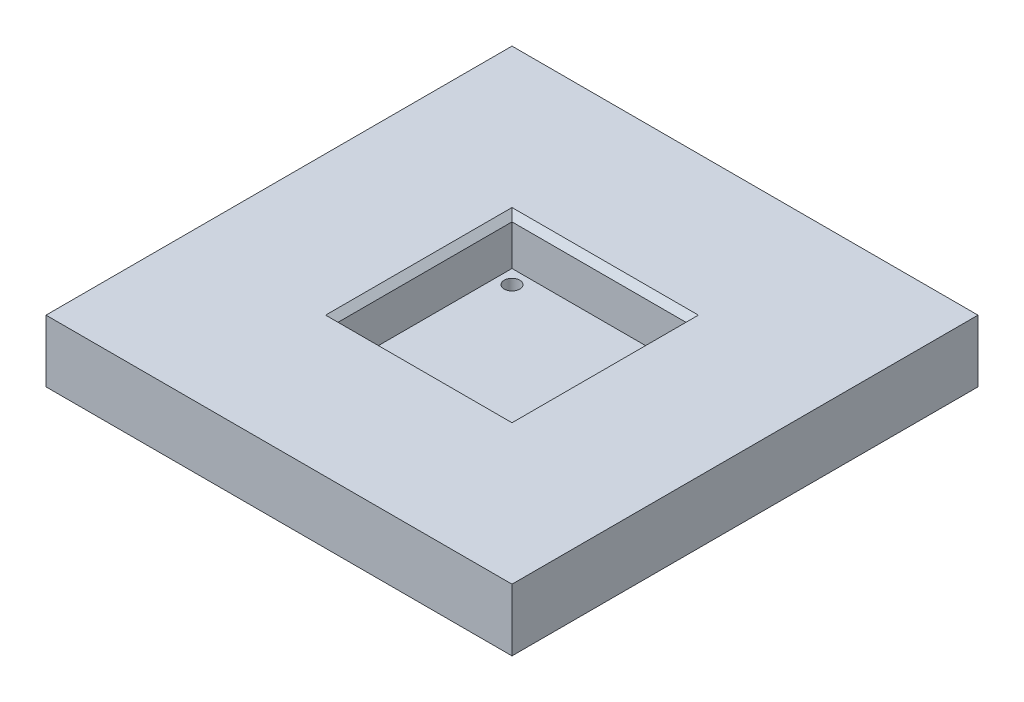
ISO-10303-21;
HEADER;
FILE_DESCRIPTION(('STEP AP214'),'2;1');
FILE_NAME('part.step','',(''),(''),'','','');
FILE_SCHEMA(('AUTOMOTIVE_DESIGN { 1 0 10303 214 1 1 1 1 }'));
ENDSEC;
DATA;
#1=APPLICATION_CONTEXT('core data for automotive mechanical design processes');
#2=APPLICATION_PROTOCOL_DEFINITION('international standard','automotive_design',2000,#1);
#3=PRODUCT_CONTEXT('',#1,'mechanical');
#4=PRODUCT('Part','Part','',(#3));
#5=PRODUCT_RELATED_PRODUCT_CATEGORY('part','',(#4));
#6=PRODUCT_DEFINITION_FORMATION('','',#4);
#7=PRODUCT_DEFINITION_CONTEXT('part definition',#1,'design');
#8=PRODUCT_DEFINITION('design','',#6,#7);
#9=PRODUCT_DEFINITION_SHAPE('','',#8);
#10=(LENGTH_UNIT() NAMED_UNIT(*) SI_UNIT(.MILLI.,.METRE.));
#11=(NAMED_UNIT(*) PLANE_ANGLE_UNIT() SI_UNIT($,.RADIAN.));
#12=(NAMED_UNIT(*) SI_UNIT($,.STERADIAN.) SOLID_ANGLE_UNIT());
#13=UNCERTAINTY_MEASURE_WITH_UNIT(LENGTH_MEASURE(1.E-05),#10,'distance_accuracy_value','');
#14=(GEOMETRIC_REPRESENTATION_CONTEXT(3) GLOBAL_UNCERTAINTY_ASSIGNED_CONTEXT((#13)) GLOBAL_UNIT_ASSIGNED_CONTEXT((#10,
#11,#12)) REPRESENTATION_CONTEXT('',''));
#15=CARTESIAN_POINT('',(0.,0.,0.));
#16=DIRECTION('',(0.,0.,1.));
#17=DIRECTION('',(1.,0.,0.));
#18=AXIS2_PLACEMENT_3D('',#15,#16,#17);
#19=CARTESIAN_POINT('',(75.,20.,75.));
#20=DIRECTION('',(-1.,0.,0.));
#21=DIRECTION('',(0.,0.,1.));
#22=AXIS2_PLACEMENT_3D('',#19,#20,#21);
#23=PLANE('',#22);
#24=DIRECTION('',(0.,0.,-1.));
#25=VECTOR('',#24,1.);
#26=CARTESIAN_POINT('',(75.,0.,75.));
#27=LINE('',#26,#25);
#28=CARTESIAN_POINT('',(75.,0.,75.));
#29=VERTEX_POINT('',#28);
#30=CARTESIAN_POINT('',(75.,0.,-75.));
#31=VERTEX_POINT('',#30);
#32=EDGE_CURVE('E141',#29,#31,#27,.T.);
#33=ORIENTED_EDGE('',*,*,#32,.T.);
#34=DIRECTION('',(0.,-1.,0.));
#35=VECTOR('',#34,1.);
#36=CARTESIAN_POINT('',(75.,20.,-75.));
#37=LINE('',#36,#35);
#38=CARTESIAN_POINT('',(75.,20.,-75.));
#39=VERTEX_POINT('',#38);
#40=EDGE_CURVE('E171',#39,#31,#37,.T.);
#41=ORIENTED_EDGE('',*,*,#40,.F.);
#42=DIRECTION('',(0.,0.,-1.));
#43=VECTOR('',#42,1.);
#44=CARTESIAN_POINT('',(75.,20.,75.));
#45=LINE('',#44,#43);
#46=CARTESIAN_POINT('',(75.,20.,75.));
#47=VERTEX_POINT('',#46);
#48=EDGE_CURVE('E145',#47,#39,#45,.T.);
#49=ORIENTED_EDGE('',*,*,#48,.F.);
#50=DIRECTION('',(0.,-1.,0.));
#51=VECTOR('',#50,1.);
#52=CARTESIAN_POINT('',(75.,20.,75.));
#53=LINE('',#52,#51);
#54=EDGE_CURVE('E155',#47,#29,#53,.T.);
#55=ORIENTED_EDGE('',*,*,#54,.T.);
#56=EDGE_LOOP('',(#33,#41,#49,#55));
#57=FACE_BOUND('',#56,.T.);
#58=ADVANCED_FACE('F32',(#57),#23,.F.);
#59=CARTESIAN_POINT('',(-75.,20.,-75.));
#60=DIRECTION('',(0.,0.,1.));
#61=DIRECTION('',(1.,0.,0.));
#62=AXIS2_PLACEMENT_3D('',#59,#60,#61);
#63=PLANE('',#62);
#64=DIRECTION('',(-1.,0.,0.));
#65=VECTOR('',#64,1.);
#66=CARTESIAN_POINT('',(-75.,0.,-75.));
#67=LINE('',#66,#65);
#68=CARTESIAN_POINT('',(-75.,0.,-75.));
#69=VERTEX_POINT('',#68);
#70=EDGE_CURVE('E158',#31,#69,#67,.T.);
#71=ORIENTED_EDGE('',*,*,#70,.T.);
#72=DIRECTION('',(0.,-1.,0.));
#73=VECTOR('',#72,1.);
#74=CARTESIAN_POINT('',(-75.,20.,-75.));
#75=LINE('',#74,#73);
#76=CARTESIAN_POINT('',(-75.,20.,-75.));
#77=VERTEX_POINT('',#76);
#78=EDGE_CURVE('E168',#77,#69,#75,.T.);
#79=ORIENTED_EDGE('',*,*,#78,.F.);
#80=DIRECTION('',(-1.,0.,0.));
#81=VECTOR('',#80,1.);
#82=CARTESIAN_POINT('',(-75.,20.,-75.));
#83=LINE('',#82,#81);
#84=EDGE_CURVE('E148',#39,#77,#83,.T.);
#85=ORIENTED_EDGE('',*,*,#84,.F.);
#86=ORIENTED_EDGE('',*,*,#40,.T.);
#87=EDGE_LOOP('',(#71,#79,#85,#86));
#88=FACE_BOUND('',#87,.T.);
#89=ADVANCED_FACE('F239',(#88),#63,.F.);
#90=CARTESIAN_POINT('',(-75.,20.,75.));
#91=DIRECTION('',(1.,0.,0.));
#92=DIRECTION('',(0.,0.,-1.));
#93=AXIS2_PLACEMENT_3D('',#90,#91,#92);
#94=PLANE('',#93);
#95=DIRECTION('',(0.,0.,1.));
#96=VECTOR('',#95,1.);
#97=CARTESIAN_POINT('',(-75.,0.,75.));
#98=LINE('',#97,#96);
#99=CARTESIAN_POINT('',(-75.,0.,75.));
#100=VERTEX_POINT('',#99);
#101=EDGE_CURVE('E160',#69,#100,#98,.T.);
#102=ORIENTED_EDGE('',*,*,#101,.T.);
#103=DIRECTION('',(0.,-1.,0.));
#104=VECTOR('',#103,1.);
#105=CARTESIAN_POINT('',(-75.,20.,75.));
#106=LINE('',#105,#104);
#107=CARTESIAN_POINT('',(-75.,20.,75.));
#108=VERTEX_POINT('',#107);
#109=EDGE_CURVE('E165',#108,#100,#106,.T.);
#110=ORIENTED_EDGE('',*,*,#109,.F.);
#111=DIRECTION('',(0.,0.,1.));
#112=VECTOR('',#111,1.);
#113=CARTESIAN_POINT('',(-75.,20.,75.));
#114=LINE('',#113,#112);
#115=EDGE_CURVE('E151',#77,#108,#114,.T.);
#116=ORIENTED_EDGE('',*,*,#115,.F.);
#117=ORIENTED_EDGE('',*,*,#78,.T.);
#118=EDGE_LOOP('',(#102,#110,#116,#117));
#119=FACE_BOUND('',#118,.T.);
#120=ADVANCED_FACE('F245',(#119),#94,.F.);
#121=CARTESIAN_POINT('',(-75.,20.,75.));
#122=DIRECTION('',(0.,0.,-1.));
#123=DIRECTION('',(-1.,0.,0.));
#124=AXIS2_PLACEMENT_3D('',#121,#122,#123);
#125=PLANE('',#124);
#126=DIRECTION('',(1.,0.,0.));
#127=VECTOR('',#126,1.);
#128=CARTESIAN_POINT('',(-75.,0.,75.));
#129=LINE('',#128,#127);
#130=EDGE_CURVE('E149',#100,#29,#129,.T.);
#131=ORIENTED_EDGE('',*,*,#130,.T.);
#132=ORIENTED_EDGE('',*,*,#54,.F.);
#133=DIRECTION('',(1.,0.,0.));
#134=VECTOR('',#133,1.);
#135=CARTESIAN_POINT('',(-75.,20.,75.));
#136=LINE('',#135,#134);
#137=EDGE_CURVE('E153',#108,#47,#136,.T.);
#138=ORIENTED_EDGE('',*,*,#137,.F.);
#139=ORIENTED_EDGE('',*,*,#109,.T.);
#140=EDGE_LOOP('',(#131,#132,#138,#139));
#141=FACE_BOUND('',#140,.T.);
#142=ADVANCED_FACE('F347',(#141),#125,.F.);
#143=CARTESIAN_POINT('',(0.,20.,0.));
#144=DIRECTION('',(0.,-1.,0.));
#145=DIRECTION('',(0.,0.,-1.));
#146=AXIS2_PLACEMENT_3D('',#143,#144,#145);
#147=PLANE('',#146);
#148=DIRECTION('',(-1.,0.,0.));
#149=VECTOR('',#148,1.);
#150=CARTESIAN_POINT('',(0.,20.,30.));
#151=LINE('',#150,#149);
#152=CARTESIAN_POINT('',(30.,20.,30.));
#153=VERTEX_POINT('',#152);
#154=CARTESIAN_POINT('',(-30.,20.,30.));
#155=VERTEX_POINT('',#154);
#156=EDGE_CURVE('E181',#153,#155,#151,.T.);
#157=ORIENTED_EDGE('',*,*,#156,.T.);
#158=DIRECTION('',(0.,0.,-1.));
#159=VECTOR('',#158,1.);
#160=CARTESIAN_POINT('',(-30.,20.,0.));
#161=LINE('',#160,#159);
#162=CARTESIAN_POINT('',(-30.,20.,-30.));
#163=VERTEX_POINT('',#162);
#164=EDGE_CURVE('E183',#155,#163,#161,.T.);
#165=ORIENTED_EDGE('',*,*,#164,.T.);
#166=DIRECTION('',(1.,0.,0.));
#167=VECTOR('',#166,1.);
#168=CARTESIAN_POINT('',(0.,20.,-30.));
#169=LINE('',#168,#167);
#170=CARTESIAN_POINT('',(30.,20.,-30.));
#171=VERTEX_POINT('',#170);
#172=EDGE_CURVE('E177',#163,#171,#169,.T.);
#173=ORIENTED_EDGE('',*,*,#172,.T.);
#174=DIRECTION('',(0.,0.,1.));
#175=VECTOR('',#174,1.);
#176=CARTESIAN_POINT('',(30.,20.,0.));
#177=LINE('',#176,#175);
#178=EDGE_CURVE('E179',#171,#153,#177,.T.);
#179=ORIENTED_EDGE('',*,*,#178,.T.);
#180=EDGE_LOOP('',(#157,#165,#173,#179));
#181=FACE_BOUND('',#180,.T.);
#182=ORIENTED_EDGE('',*,*,#48,.T.);
#183=ORIENTED_EDGE('',*,*,#84,.T.);
#184=ORIENTED_EDGE('',*,*,#115,.T.);
#185=ORIENTED_EDGE('',*,*,#137,.T.);
#186=EDGE_LOOP('',(#182,#183,#184,#185));
#187=FACE_BOUND('',#186,.T.);
#188=ADVANCED_FACE('F344',(#181,#187),#147,.F.);
#189=CARTESIAN_POINT('',(0.,0.,0.));
#190=DIRECTION('',(0.,-1.,0.));
#191=DIRECTION('',(0.,0.,-1.));
#192=AXIS2_PLACEMENT_3D('',#189,#190,#191);
#193=PLANE('',#192);
#194=CARTESIAN_POINT('',(-60.,0.,-60.));
#195=DIRECTION('',(0.,-1.,0.));
#196=DIRECTION('',(0.,0.,-1.));
#197=AXIS2_PLACEMENT_3D('',#194,#195,#196);
#198=CIRCLE('',#197,5.99999999999998);
#199=CARTESIAN_POINT('',(-60.,0.,-66.));
#200=VERTEX_POINT('',#199);
#201=EDGE_CURVE('E214',#200,#200,#198,.F.);
#202=ORIENTED_EDGE('',*,*,#201,.T.);
#203=EDGE_LOOP('',(#202));
#204=FACE_BOUND('',#203,.T.);
#205=CARTESIAN_POINT('',(60.,0.,-60.));
#206=DIRECTION('',(0.,-1.,0.));
#207=DIRECTION('',(0.,0.,-1.));
#208=AXIS2_PLACEMENT_3D('',#205,#206,#207);
#209=CIRCLE('',#208,5.99999999999998);
#210=CARTESIAN_POINT('',(60.,0.,-66.));
#211=VERTEX_POINT('',#210);
#212=EDGE_CURVE('E211',#211,#211,#209,.F.);
#213=ORIENTED_EDGE('',*,*,#212,.T.);
#214=EDGE_LOOP('',(#213));
#215=FACE_BOUND('',#214,.T.);
#216=CARTESIAN_POINT('',(60.,0.,60.));
#217=DIRECTION('',(0.,-1.,0.));
#218=DIRECTION('',(0.,0.,-1.));
#219=AXIS2_PLACEMENT_3D('',#216,#217,#218);
#220=CIRCLE('',#219,5.99999999999998);
#221=CARTESIAN_POINT('',(60.,0.,54.));
#222=VERTEX_POINT('',#221);
#223=EDGE_CURVE('E208',#222,#222,#220,.F.);
#224=ORIENTED_EDGE('',*,*,#223,.T.);
#225=EDGE_LOOP('',(#224));
#226=FACE_BOUND('',#225,.T.);
#227=CARTESIAN_POINT('',(-60.,0.,60.));
#228=DIRECTION('',(0.,-1.,0.));
#229=DIRECTION('',(0.,0.,-1.));
#230=AXIS2_PLACEMENT_3D('',#227,#228,#229);
#231=CIRCLE('',#230,5.99999999999998);
#232=CARTESIAN_POINT('',(-60.,0.,54.));
#233=VERTEX_POINT('',#232);
#234=EDGE_CURVE('E205',#233,#233,#231,.F.);
#235=ORIENTED_EDGE('',*,*,#234,.T.);
#236=EDGE_LOOP('',(#235));
#237=FACE_BOUND('',#236,.T.);
#238=CARTESIAN_POINT('',(-23.5,0.,23.5));
#239=DIRECTION('',(0.,-1.,0.));
#240=DIRECTION('',(0.,0.,-1.));
#241=AXIS2_PLACEMENT_3D('',#238,#239,#240);
#242=CIRCLE('',#241,2.5);
#243=CARTESIAN_POINT('',(-23.5,0.,21.));
#244=VERTEX_POINT('',#243);
#245=EDGE_CURVE('E300',#244,#244,#242,.T.);
#246=ORIENTED_EDGE('',*,*,#245,.F.);
#247=EDGE_LOOP('',(#246));
#248=FACE_BOUND('',#247,.T.);
#249=CARTESIAN_POINT('',(23.5,0.,23.5));
#250=DIRECTION('',(0.,-1.,0.));
#251=DIRECTION('',(0.,0.,-1.));
#252=AXIS2_PLACEMENT_3D('',#249,#250,#251);
#253=CIRCLE('',#252,2.5);
#254=CARTESIAN_POINT('',(23.5,0.,21.));
#255=VERTEX_POINT('',#254);
#256=EDGE_CURVE('E306',#255,#255,#253,.T.);
#257=ORIENTED_EDGE('',*,*,#256,.F.);
#258=EDGE_LOOP('',(#257));
#259=FACE_BOUND('',#258,.T.);
#260=CARTESIAN_POINT('',(23.5,0.,-23.5));
#261=DIRECTION('',(0.,-1.,0.));
#262=DIRECTION('',(0.,0.,-1.));
#263=AXIS2_PLACEMENT_3D('',#260,#261,#262);
#264=CIRCLE('',#263,2.5);
#265=CARTESIAN_POINT('',(23.5,0.,-26.));
#266=VERTEX_POINT('',#265);
#267=EDGE_CURVE('E312',#266,#266,#264,.T.);
#268=ORIENTED_EDGE('',*,*,#267,.F.);
#269=EDGE_LOOP('',(#268));
#270=FACE_BOUND('',#269,.T.);
#271=CARTESIAN_POINT('',(-23.5,0.,-23.5));
#272=DIRECTION('',(0.,-1.,0.));
#273=DIRECTION('',(0.,0.,-1.));
#274=AXIS2_PLACEMENT_3D('',#271,#272,#273);
#275=CIRCLE('',#274,2.5);
#276=CARTESIAN_POINT('',(-23.5,0.,-26.));
#277=VERTEX_POINT('',#276);
#278=EDGE_CURVE('E130',#277,#277,#275,.T.);
#279=ORIENTED_EDGE('',*,*,#278,.F.);
#280=EDGE_LOOP('',(#279));
#281=FACE_BOUND('',#280,.T.);
#282=ORIENTED_EDGE('',*,*,#32,.F.);
#283=ORIENTED_EDGE('',*,*,#130,.F.);
#284=ORIENTED_EDGE('',*,*,#101,.F.);
#285=ORIENTED_EDGE('',*,*,#70,.F.);
#286=EDGE_LOOP('',(#282,#283,#284,#285));
#287=FACE_BOUND('',#286,.T.);
#288=ADVANCED_FACE('F343',(#204,#215,#226,#237,#248,#259,#270,#281,#287),#193,.T.);
#289=CARTESIAN_POINT('',(28.,5.,28.));
#290=DIRECTION('',(1.,0.,0.));
#291=DIRECTION('',(0.,0.,-1.));
#292=AXIS2_PLACEMENT_3D('',#289,#290,#291);
#293=PLANE('',#292);
#294=DIRECTION('',(0.,1.,0.));
#295=VECTOR('',#294,1.);
#296=CARTESIAN_POINT('',(28.,5.,28.));
#297=LINE('',#296,#295);
#298=CARTESIAN_POINT('',(28.,5.,28.));
#299=VERTEX_POINT('',#298);
#300=CARTESIAN_POINT('',(28.,18.,28.));
#301=VERTEX_POINT('',#300);
#302=EDGE_CURVE('E139',#299,#301,#297,.T.);
#303=ORIENTED_EDGE('',*,*,#302,.T.);
#304=DIRECTION('',(0.,0.,-1.));
#305=VECTOR('',#304,1.);
#306=CARTESIAN_POINT('',(28.,18.,28.));
#307=LINE('',#306,#305);
#308=CARTESIAN_POINT('',(28.,18.,-28.));
#309=VERTEX_POINT('',#308);
#310=EDGE_CURVE('E47',#301,#309,#307,.T.);
#311=ORIENTED_EDGE('',*,*,#310,.T.);
#312=DIRECTION('',(0.,1.,0.));
#313=VECTOR('',#312,1.);
#314=CARTESIAN_POINT('',(28.,5.,-28.));
#315=LINE('',#314,#313);
#316=CARTESIAN_POINT('',(28.,5.,-28.));
#317=VERTEX_POINT('',#316);
#318=EDGE_CURVE('E108',#317,#309,#315,.T.);
#319=ORIENTED_EDGE('',*,*,#318,.F.);
#320=DIRECTION('',(0.,0.,-1.));
#321=VECTOR('',#320,1.);
#322=CARTESIAN_POINT('',(28.,5.,28.));
#323=LINE('',#322,#321);
#324=EDGE_CURVE('E112',#299,#317,#323,.T.);
#325=ORIENTED_EDGE('',*,*,#324,.F.);
#326=EDGE_LOOP('',(#303,#311,#319,#325));
#327=FACE_BOUND('',#326,.T.);
#328=ADVANCED_FACE('F110',(#327),#293,.F.);
#329=CARTESIAN_POINT('',(-28.,5.,28.));
#330=DIRECTION('',(0.,0.,1.));
#331=DIRECTION('',(1.,0.,0.));
#332=AXIS2_PLACEMENT_3D('',#329,#330,#331);
#333=PLANE('',#332);
#334=DIRECTION('',(0.,1.,0.));
#335=VECTOR('',#334,1.);
#336=CARTESIAN_POINT('',(-28.,5.,28.));
#337=LINE('',#336,#335);
#338=CARTESIAN_POINT('',(-28.,5.,28.));
#339=VERTEX_POINT('',#338);
#340=CARTESIAN_POINT('',(-28.,18.,28.));
#341=VERTEX_POINT('',#340);
#342=EDGE_CURVE('E142',#339,#341,#337,.T.);
#343=ORIENTED_EDGE('',*,*,#342,.T.);
#344=DIRECTION('',(1.,0.,0.));
#345=VECTOR('',#344,1.);
#346=CARTESIAN_POINT('',(-28.,18.,28.));
#347=LINE('',#346,#345);
#348=EDGE_CURVE('E55',#341,#301,#347,.T.);
#349=ORIENTED_EDGE('',*,*,#348,.T.);
#350=ORIENTED_EDGE('',*,*,#302,.F.);
#351=DIRECTION('',(1.,0.,0.));
#352=VECTOR('',#351,1.);
#353=CARTESIAN_POINT('',(-28.,5.,28.));
#354=LINE('',#353,#352);
#355=EDGE_CURVE('E117',#339,#299,#354,.T.);
#356=ORIENTED_EDGE('',*,*,#355,.F.);
#357=EDGE_LOOP('',(#343,#349,#350,#356));
#358=FACE_BOUND('',#357,.T.);
#359=ADVANCED_FACE('F335',(#358),#333,.F.);
#360=CARTESIAN_POINT('',(-28.,5.,28.));
#361=DIRECTION('',(-1.,0.,0.));
#362=DIRECTION('',(0.,0.,1.));
#363=AXIS2_PLACEMENT_3D('',#360,#361,#362);
#364=PLANE('',#363);
#365=DIRECTION('',(0.,1.,0.));
#366=VECTOR('',#365,1.);
#367=CARTESIAN_POINT('',(-28.,5.,-28.));
#368=LINE('',#367,#366);
#369=CARTESIAN_POINT('',(-28.,5.,-28.));
#370=VERTEX_POINT('',#369);
#371=CARTESIAN_POINT('',(-28.,18.,-28.));
#372=VERTEX_POINT('',#371);
#373=EDGE_CURVE('E116',#370,#372,#368,.T.);
#374=ORIENTED_EDGE('',*,*,#373,.T.);
#375=DIRECTION('',(0.,0.,1.));
#376=VECTOR('',#375,1.);
#377=CARTESIAN_POINT('',(-28.,18.,28.));
#378=LINE('',#377,#376);
#379=EDGE_CURVE('E174',#372,#341,#378,.T.);
#380=ORIENTED_EDGE('',*,*,#379,.T.);
#381=ORIENTED_EDGE('',*,*,#342,.F.);
#382=DIRECTION('',(0.,0.,1.));
#383=VECTOR('',#382,1.);
#384=CARTESIAN_POINT('',(-28.,5.,28.));
#385=LINE('',#384,#383);
#386=EDGE_CURVE('E126',#370,#339,#385,.T.);
#387=ORIENTED_EDGE('',*,*,#386,.F.);
#388=EDGE_LOOP('',(#374,#380,#381,#387));
#389=FACE_BOUND('',#388,.T.);
#390=ADVANCED_FACE('F329',(#389),#364,.F.);
#391=CARTESIAN_POINT('',(-28.,5.,-28.));
#392=DIRECTION('',(0.,0.,-1.));
#393=DIRECTION('',(-1.,0.,0.));
#394=AXIS2_PLACEMENT_3D('',#391,#392,#393);
#395=PLANE('',#394);
#396=ORIENTED_EDGE('',*,*,#318,.T.);
#397=DIRECTION('',(-1.,0.,0.));
#398=VECTOR('',#397,1.);
#399=CARTESIAN_POINT('',(-28.,18.,-28.));
#400=LINE('',#399,#398);
#401=EDGE_CURVE('E188',#309,#372,#400,.T.);
#402=ORIENTED_EDGE('',*,*,#401,.T.);
#403=ORIENTED_EDGE('',*,*,#373,.F.);
#404=DIRECTION('',(-1.,0.,0.));
#405=VECTOR('',#404,1.);
#406=CARTESIAN_POINT('',(-28.,5.,-28.));
#407=LINE('',#406,#405);
#408=EDGE_CURVE('E120',#317,#370,#407,.T.);
#409=ORIENTED_EDGE('',*,*,#408,.F.);
#410=EDGE_LOOP('',(#396,#402,#403,#409));
#411=FACE_BOUND('',#410,.T.);
#412=ADVANCED_FACE('F121',(#411),#395,.F.);
#413=CARTESIAN_POINT('',(0.,5.,0.));
#414=DIRECTION('',(0.,-1.,0.));
#415=DIRECTION('',(0.,0.,-1.));
#416=AXIS2_PLACEMENT_3D('',#413,#414,#415);
#417=PLANE('',#416);
#418=CARTESIAN_POINT('',(-23.5,5.,23.5));
#419=DIRECTION('',(0.,1.,0.));
#420=DIRECTION('',(0.,0.,1.));
#421=AXIS2_PLACEMENT_3D('',#418,#419,#420);
#422=CIRCLE('',#421,2.5);
#423=CARTESIAN_POINT('',(-23.5,5.,26.));
#424=VERTEX_POINT('',#423);
#425=EDGE_CURVE('E202',#424,#424,#422,.T.);
#426=ORIENTED_EDGE('',*,*,#425,.F.);
#427=EDGE_LOOP('',(#426));
#428=FACE_BOUND('',#427,.T.);
#429=CARTESIAN_POINT('',(23.5,5.,23.5));
#430=DIRECTION('',(0.,1.,0.));
#431=DIRECTION('',(0.,0.,1.));
#432=AXIS2_PLACEMENT_3D('',#429,#430,#431);
#433=CIRCLE('',#432,2.5);
#434=CARTESIAN_POINT('',(23.5,5.,26.));
#435=VERTEX_POINT('',#434);
#436=EDGE_CURVE('E303',#435,#435,#433,.T.);
#437=ORIENTED_EDGE('',*,*,#436,.F.);
#438=EDGE_LOOP('',(#437));
#439=FACE_BOUND('',#438,.T.);
#440=CARTESIAN_POINT('',(23.5,5.,-23.5));
#441=DIRECTION('',(0.,1.,0.));
#442=DIRECTION('',(0.,0.,1.));
#443=AXIS2_PLACEMENT_3D('',#440,#441,#442);
#444=CIRCLE('',#443,2.5);
#445=CARTESIAN_POINT('',(23.5,5.,-21.));
#446=VERTEX_POINT('',#445);
#447=EDGE_CURVE('E309',#446,#446,#444,.T.);
#448=ORIENTED_EDGE('',*,*,#447,.F.);
#449=EDGE_LOOP('',(#448));
#450=FACE_BOUND('',#449,.T.);
#451=CARTESIAN_POINT('',(-23.5,5.,-23.5));
#452=DIRECTION('',(0.,1.,0.));
#453=DIRECTION('',(0.,0.,1.));
#454=AXIS2_PLACEMENT_3D('',#451,#452,#453);
#455=CIRCLE('',#454,2.5);
#456=CARTESIAN_POINT('',(-23.5,5.,-21.));
#457=VERTEX_POINT('',#456);
#458=EDGE_CURVE('E133',#457,#457,#455,.T.);
#459=ORIENTED_EDGE('',*,*,#458,.F.);
#460=EDGE_LOOP('',(#459));
#461=FACE_BOUND('',#460,.T.);
#462=ORIENTED_EDGE('',*,*,#324,.T.);
#463=ORIENTED_EDGE('',*,*,#408,.T.);
#464=ORIENTED_EDGE('',*,*,#386,.T.);
#465=ORIENTED_EDGE('',*,*,#355,.T.);
#466=EDGE_LOOP('',(#462,#463,#464,#465));
#467=FACE_BOUND('',#466,.T.);
#468=ADVANCED_FACE('F128',(#428,#439,#450,#461,#467),#417,.F.);
#469=CARTESIAN_POINT('',(-23.5,-10.,-23.5));
#470=DIRECTION('',(0.,1.,0.));
#471=DIRECTION('',(0.,0.,1.));
#472=AXIS2_PLACEMENT_3D('',#469,#470,#471);
#473=CYLINDRICAL_SURFACE('',#472,2.5);
#474=ORIENTED_EDGE('',*,*,#278,.T.);
#475=EDGE_LOOP('',(#474));
#476=FACE_BOUND('',#475,.T.);
#477=ORIENTED_EDGE('',*,*,#458,.T.);
#478=EDGE_LOOP('',(#477));
#479=FACE_BOUND('',#478,.T.);
#480=ADVANCED_FACE('F317',(#476,#479),#473,.F.);
#481=CARTESIAN_POINT('',(23.5,-10.,-23.5));
#482=DIRECTION('',(0.,1.,0.));
#483=DIRECTION('',(0.,0.,1.));
#484=AXIS2_PLACEMENT_3D('',#481,#482,#483);
#485=CYLINDRICAL_SURFACE('',#484,2.5);
#486=ORIENTED_EDGE('',*,*,#267,.T.);
#487=EDGE_LOOP('',(#486));
#488=FACE_BOUND('',#487,.T.);
#489=ORIENTED_EDGE('',*,*,#447,.T.);
#490=EDGE_LOOP('',(#489));
#491=FACE_BOUND('',#490,.T.);
#492=ADVANCED_FACE('F326',(#488,#491),#485,.F.);
#493=CARTESIAN_POINT('',(23.5,-10.,23.5));
#494=DIRECTION('',(0.,1.,0.));
#495=DIRECTION('',(0.,0.,1.));
#496=AXIS2_PLACEMENT_3D('',#493,#494,#495);
#497=CYLINDRICAL_SURFACE('',#496,2.5);
#498=ORIENTED_EDGE('',*,*,#256,.T.);
#499=EDGE_LOOP('',(#498));
#500=FACE_BOUND('',#499,.T.);
#501=ORIENTED_EDGE('',*,*,#436,.T.);
#502=EDGE_LOOP('',(#501));
#503=FACE_BOUND('',#502,.T.);
#504=ADVANCED_FACE('F523',(#500,#503),#497,.F.);
#505=CARTESIAN_POINT('',(-23.5,-10.,23.5));
#506=DIRECTION('',(0.,1.,0.));
#507=DIRECTION('',(0.,0.,1.));
#508=AXIS2_PLACEMENT_3D('',#505,#506,#507);
#509=CYLINDRICAL_SURFACE('',#508,2.5);
#510=ORIENTED_EDGE('',*,*,#245,.T.);
#511=EDGE_LOOP('',(#510));
#512=FACE_BOUND('',#511,.T.);
#513=ORIENTED_EDGE('',*,*,#425,.T.);
#514=EDGE_LOOP('',(#513));
#515=FACE_BOUND('',#514,.T.);
#516=ADVANCED_FACE('F266',(#512,#515),#509,.F.);
#517=CARTESIAN_POINT('',(28.,18.,28.));
#518=DIRECTION('',(0.707106781186547,-0.707106781186547,0.));
#519=DIRECTION('',(0.,0.,-1.));
#520=AXIS2_PLACEMENT_3D('',#517,#518,#519);
#521=PLANE('',#520);
#522=DIRECTION('',(0.577350269189626,0.577350269189626,0.577350269189626));
#523=VECTOR('',#522,1.);
#524=CARTESIAN_POINT('',(9.33333333333333,-0.666666666666642,9.33333333333333));
#525=LINE('',#524,#523);
#526=EDGE_CURVE('E196',#153,#301,#525,.F.);
#527=ORIENTED_EDGE('',*,*,#526,.F.);
#528=ORIENTED_EDGE('',*,*,#178,.F.);
#529=DIRECTION('',(0.577350269189626,0.577350269189626,-0.577350269189626));
#530=VECTOR('',#529,1.);
#531=CARTESIAN_POINT('',(9.33333333333333,-0.666666666666642,-9.33333333333334));
#532=LINE('',#531,#530);
#533=EDGE_CURVE('E199',#309,#171,#532,.T.);
#534=ORIENTED_EDGE('',*,*,#533,.F.);
#535=ORIENTED_EDGE('',*,*,#310,.F.);
#536=EDGE_LOOP('',(#527,#528,#534,#535));
#537=FACE_BOUND('',#536,.T.);
#538=ADVANCED_FACE('F262',(#537),#521,.F.);
#539=CARTESIAN_POINT('',(-28.,18.,-28.));
#540=DIRECTION('',(0.,-0.707106781186547,-0.707106781186547));
#541=DIRECTION('',(-1.,0.,0.));
#542=AXIS2_PLACEMENT_3D('',#539,#540,#541);
#543=PLANE('',#542);
#544=ORIENTED_EDGE('',*,*,#533,.T.);
#545=ORIENTED_EDGE('',*,*,#172,.F.);
#546=DIRECTION('',(0.577350269189626,-0.577350269189626,0.577350269189626));
#547=VECTOR('',#546,1.);
#548=CARTESIAN_POINT('',(-9.33333333333334,-0.666666666666642,-9.33333333333334));
#549=LINE('',#548,#547);
#550=EDGE_CURVE('E193',#372,#163,#549,.F.);
#551=ORIENTED_EDGE('',*,*,#550,.F.);
#552=ORIENTED_EDGE('',*,*,#401,.F.);
#553=EDGE_LOOP('',(#544,#545,#551,#552));
#554=FACE_BOUND('',#553,.T.);
#555=ADVANCED_FACE('F258',(#554),#543,.F.);
#556=CARTESIAN_POINT('',(-28.,18.,28.));
#557=DIRECTION('',(0.,-0.707106781186547,0.707106781186547));
#558=DIRECTION('',(1.,0.,0.));
#559=AXIS2_PLACEMENT_3D('',#556,#557,#558);
#560=PLANE('',#559);
#561=ORIENTED_EDGE('',*,*,#526,.T.);
#562=ORIENTED_EDGE('',*,*,#348,.F.);
#563=DIRECTION('',(-0.577350269189626,0.577350269189626,0.577350269189626));
#564=VECTOR('',#563,1.);
#565=CARTESIAN_POINT('',(-28.,18.,28.));
#566=LINE('',#565,#564);
#567=EDGE_CURVE('E191',#155,#341,#566,.F.);
#568=ORIENTED_EDGE('',*,*,#567,.F.);
#569=ORIENTED_EDGE('',*,*,#156,.F.);
#570=EDGE_LOOP('',(#561,#562,#568,#569));
#571=FACE_BOUND('',#570,.T.);
#572=ADVANCED_FACE('F254',(#571),#560,.F.);
#573=CARTESIAN_POINT('',(-28.,18.,28.));
#574=DIRECTION('',(-0.707106781186547,-0.707106781186547,0.));
#575=DIRECTION('',(0.,0.,1.));
#576=AXIS2_PLACEMENT_3D('',#573,#574,#575);
#577=PLANE('',#576);
#578=ORIENTED_EDGE('',*,*,#550,.T.);
#579=ORIENTED_EDGE('',*,*,#164,.F.);
#580=ORIENTED_EDGE('',*,*,#567,.T.);
#581=ORIENTED_EDGE('',*,*,#379,.F.);
#582=EDGE_LOOP('',(#578,#579,#580,#581));
#583=FACE_BOUND('',#582,.T.);
#584=ADVANCED_FACE('F250',(#583),#577,.F.);
#585=CARTESIAN_POINT('',(-60.,15.,60.));
#586=DIRECTION('',(0.,-1.,0.));
#587=DIRECTION('',(0.,0.,-1.));
#588=AXIS2_PLACEMENT_3D('',#585,#586,#587);
#589=CYLINDRICAL_SURFACE('',#588,5.00000000000001);
#590=CARTESIAN_POINT('',(-60.,0.999999999999963,60.));
#591=DIRECTION('',(0.,-1.,0.));
#592=DIRECTION('',(0.,0.,-1.));
#593=AXIS2_PLACEMENT_3D('',#590,#591,#592);
#594=CIRCLE('',#593,5.00000000000001);
#595=CARTESIAN_POINT('',(-60.,0.999999999999963,55.));
#596=VERTEX_POINT('',#595);
#597=EDGE_CURVE('E11',#596,#596,#594,.T.);
#598=ORIENTED_EDGE('',*,*,#597,.T.);
#599=EDGE_LOOP('',(#598));
#600=FACE_BOUND('',#599,.T.);
#601=CARTESIAN_POINT('',(-60.,15.,60.));
#602=DIRECTION('',(0.,-1.,0.));
#603=DIRECTION('',(0.,0.,-1.));
#604=AXIS2_PLACEMENT_3D('',#601,#602,#603);
#605=CIRCLE('',#604,5.00000000000001);
#606=CARTESIAN_POINT('',(-60.,15.,55.));
#607=VERTEX_POINT('',#606);
#608=EDGE_CURVE('E194',#607,#607,#605,.T.);
#609=ORIENTED_EDGE('',*,*,#608,.F.);
#610=EDGE_LOOP('',(#609));
#611=FACE_BOUND('',#610,.T.);
#612=ADVANCED_FACE('F253',(#600,#611),#589,.F.);
#613=CARTESIAN_POINT('',(-60.,15.,60.));
#614=DIRECTION('',(0.,-1.,0.));
#615=DIRECTION('',(0.,0.,-1.));
#616=AXIS2_PLACEMENT_3D('',#613,#614,#615);
#617=PLANE('',#616);
#618=ORIENTED_EDGE('',*,*,#608,.T.);
#619=EDGE_LOOP('',(#618));
#620=FACE_BOUND('',#619,.T.);
#621=ADVANCED_FACE('F437',(#620),#617,.T.);
#622=CARTESIAN_POINT('',(60.,15.,60.));
#623=DIRECTION('',(0.,-1.,0.));
#624=DIRECTION('',(0.,0.,-1.));
#625=AXIS2_PLACEMENT_3D('',#622,#623,#624);
#626=CYLINDRICAL_SURFACE('',#625,5.00000000000001);
#627=CARTESIAN_POINT('',(60.,0.999999999999963,60.));
#628=DIRECTION('',(0.,-1.,0.));
#629=DIRECTION('',(0.,0.,-1.));
#630=AXIS2_PLACEMENT_3D('',#627,#628,#629);
#631=CIRCLE('',#630,5.00000000000001);
#632=CARTESIAN_POINT('',(60.,0.999999999999963,55.));
#633=VERTEX_POINT('',#632);
#634=EDGE_CURVE('E40',#633,#633,#631,.T.);
#635=ORIENTED_EDGE('',*,*,#634,.T.);
#636=EDGE_LOOP('',(#635));
#637=FACE_BOUND('',#636,.T.);
#638=CARTESIAN_POINT('',(60.,15.,60.));
#639=DIRECTION('',(0.,-1.,0.));
#640=DIRECTION('',(0.,0.,1.));
#641=AXIS2_PLACEMENT_3D('',#638,#639,#640);
#642=CIRCLE('',#641,5.00000000000001);
#643=CARTESIAN_POINT('',(60.,15.,65.));
#644=VERTEX_POINT('',#643);
#645=EDGE_CURVE('E291',#644,#644,#642,.T.);
#646=ORIENTED_EDGE('',*,*,#645,.F.);
#647=EDGE_LOOP('',(#646));
#648=FACE_BOUND('',#647,.T.);
#649=ADVANCED_FACE('F222',(#637,#648),#626,.F.);
#650=CARTESIAN_POINT('',(60.,15.,60.));
#651=DIRECTION('',(0.,1.,0.));
#652=DIRECTION('',(0.,0.,1.));
#653=AXIS2_PLACEMENT_3D('',#650,#651,#652);
#654=PLANE('',#653);
#655=ORIENTED_EDGE('',*,*,#645,.T.);
#656=EDGE_LOOP('',(#655));
#657=FACE_BOUND('',#656,.T.);
#658=ADVANCED_FACE('F449',(#657),#654,.F.);
#659=CARTESIAN_POINT('',(60.,15.,-60.));
#660=DIRECTION('',(0.,-1.,0.));
#661=DIRECTION('',(0.,0.,-1.));
#662=AXIS2_PLACEMENT_3D('',#659,#660,#661);
#663=CYLINDRICAL_SURFACE('',#662,4.99999999999998);
#664=CARTESIAN_POINT('',(60.,0.999999999999989,-60.));
#665=DIRECTION('',(0.,-1.,0.));
#666=DIRECTION('',(0.,0.,-1.));
#667=AXIS2_PLACEMENT_3D('',#664,#665,#666);
#668=CIRCLE('',#667,4.99999999999998);
#669=CARTESIAN_POINT('',(60.,0.999999999999989,-65.));
#670=VERTEX_POINT('',#669);
#671=EDGE_CURVE('E217',#670,#670,#668,.T.);
#672=ORIENTED_EDGE('',*,*,#671,.T.);
#673=EDGE_LOOP('',(#672));
#674=FACE_BOUND('',#673,.T.);
#675=CARTESIAN_POINT('',(60.,15.,-60.));
#676=DIRECTION('',(0.,-1.,0.));
#677=DIRECTION('',(0.,0.,-1.));
#678=AXIS2_PLACEMENT_3D('',#675,#676,#677);
#679=CIRCLE('',#678,4.99999999999998);
#680=CARTESIAN_POINT('',(60.,15.,-65.));
#681=VERTEX_POINT('',#680);
#682=EDGE_CURVE('E288',#681,#681,#679,.T.);
#683=ORIENTED_EDGE('',*,*,#682,.F.);
#684=EDGE_LOOP('',(#683));
#685=FACE_BOUND('',#684,.T.);
#686=ADVANCED_FACE('F454',(#674,#685),#663,.F.);
#687=CARTESIAN_POINT('',(60.,15.,-60.));
#688=DIRECTION('',(0.,-1.,0.));
#689=DIRECTION('',(0.,0.,-1.));
#690=AXIS2_PLACEMENT_3D('',#687,#688,#689);
#691=PLANE('',#690);
#692=ORIENTED_EDGE('',*,*,#682,.T.);
#693=EDGE_LOOP('',(#692));
#694=FACE_BOUND('',#693,.T.);
#695=ADVANCED_FACE('F283',(#694),#691,.T.);
#696=CARTESIAN_POINT('',(-60.,15.,-60.));
#697=DIRECTION('',(0.,-1.,0.));
#698=DIRECTION('',(0.,0.,-1.));
#699=AXIS2_PLACEMENT_3D('',#696,#697,#698);
#700=CYLINDRICAL_SURFACE('',#699,4.99999999999998);
#701=CARTESIAN_POINT('',(-60.,0.999999999999989,-60.));
#702=DIRECTION('',(0.,-1.,0.));
#703=DIRECTION('',(0.,0.,-1.));
#704=AXIS2_PLACEMENT_3D('',#701,#702,#703);
#705=CIRCLE('',#704,4.99999999999998);
#706=CARTESIAN_POINT('',(-60.,0.999999999999989,-65.));
#707=VERTEX_POINT('',#706);
#708=EDGE_CURVE('E190',#707,#707,#705,.T.);
#709=ORIENTED_EDGE('',*,*,#708,.T.);
#710=EDGE_LOOP('',(#709));
#711=FACE_BOUND('',#710,.T.);
#712=CARTESIAN_POINT('',(-60.,15.,-60.));
#713=DIRECTION('',(0.,-1.,0.));
#714=DIRECTION('',(0.,0.,1.));
#715=AXIS2_PLACEMENT_3D('',#712,#713,#714);
#716=CIRCLE('',#715,4.99999999999998);
#717=CARTESIAN_POINT('',(-60.,15.,-55.));
#718=VERTEX_POINT('',#717);
#719=EDGE_CURVE('E287',#718,#718,#716,.T.);
#720=ORIENTED_EDGE('',*,*,#719,.F.);
#721=EDGE_LOOP('',(#720));
#722=FACE_BOUND('',#721,.T.);
#723=ADVANCED_FACE('F274',(#711,#722),#700,.F.);
#724=CARTESIAN_POINT('',(-60.,15.,-60.));
#725=DIRECTION('',(0.,1.,0.));
#726=DIRECTION('',(0.,0.,1.));
#727=AXIS2_PLACEMENT_3D('',#724,#725,#726);
#728=PLANE('',#727);
#729=ORIENTED_EDGE('',*,*,#719,.T.);
#730=EDGE_LOOP('',(#729));
#731=FACE_BOUND('',#730,.T.);
#732=ADVANCED_FACE('F269',(#731),#728,.F.);
#733=CARTESIAN_POINT('',(-60.,0.999999999999989,-60.));
#734=DIRECTION('',(0.,-1.,0.));
#735=DIRECTION('',(0.,0.,-1.));
#736=AXIS2_PLACEMENT_3D('',#733,#734,#735);
#737=CONICAL_SURFACE('',#736,4.99999999999998,0.785398163397453);
#738=ORIENTED_EDGE('',*,*,#201,.F.);
#739=EDGE_LOOP('',(#738));
#740=FACE_BOUND('',#739,.T.);
#741=ORIENTED_EDGE('',*,*,#708,.F.);
#742=EDGE_LOOP('',(#741));
#743=FACE_BOUND('',#742,.T.);
#744=ADVANCED_FACE('F234',(#740,#743),#737,.F.);
#745=CARTESIAN_POINT('',(60.,0.999999999999989,-60.));
#746=DIRECTION('',(0.,-1.,0.));
#747=DIRECTION('',(0.,0.,-1.));
#748=AXIS2_PLACEMENT_3D('',#745,#746,#747);
#749=CONICAL_SURFACE('',#748,4.99999999999998,0.785398163397453);
#750=ORIENTED_EDGE('',*,*,#212,.F.);
#751=EDGE_LOOP('',(#750));
#752=FACE_BOUND('',#751,.T.);
#753=ORIENTED_EDGE('',*,*,#671,.F.);
#754=EDGE_LOOP('',(#753));
#755=FACE_BOUND('',#754,.T.);
#756=ADVANCED_FACE('F227',(#752,#755),#749,.F.);
#757=CARTESIAN_POINT('',(60.,0.999999999999963,60.));
#758=DIRECTION('',(0.,-1.,0.));
#759=DIRECTION('',(0.,0.,-1.));
#760=AXIS2_PLACEMENT_3D('',#757,#758,#759);
#761=CONICAL_SURFACE('',#760,5.00000000000001,0.785398163397453);
#762=ORIENTED_EDGE('',*,*,#223,.F.);
#763=EDGE_LOOP('',(#762));
#764=FACE_BOUND('',#763,.T.);
#765=ORIENTED_EDGE('',*,*,#634,.F.);
#766=EDGE_LOOP('',(#765));
#767=FACE_BOUND('',#766,.T.);
#768=ADVANCED_FACE('F225',(#764,#767),#761,.F.);
#769=CARTESIAN_POINT('',(-60.,0.999999999999963,60.));
#770=DIRECTION('',(0.,-1.,0.));
#771=DIRECTION('',(0.,0.,-1.));
#772=AXIS2_PLACEMENT_3D('',#769,#770,#771);
#773=CONICAL_SURFACE('',#772,5.00000000000001,0.785398163397453);
#774=ORIENTED_EDGE('',*,*,#234,.F.);
#775=EDGE_LOOP('',(#774));
#776=FACE_BOUND('',#775,.T.);
#777=ORIENTED_EDGE('',*,*,#597,.F.);
#778=EDGE_LOOP('',(#777));
#779=FACE_BOUND('',#778,.T.);
#780=ADVANCED_FACE('F34',(#776,#779),#773,.F.);
#781=CLOSED_SHELL('',(#58,#89,#120,#142,#188,#288,#328,#359,#390,#412,#468,#480,#492,#504,#516,
#538,#555,#572,#584,#612,#621,#649,#658,#686,#695,#723,#732,#744,#756,#768,#780));
#782=MANIFOLD_SOLID_BREP('B2',#781);
#783=ADVANCED_BREP_SHAPE_REPRESENTATION('',(#18,#782),#14);
#784=SHAPE_DEFINITION_REPRESENTATION(#9,#783);
ENDSEC;
END-ISO-10303-21;
